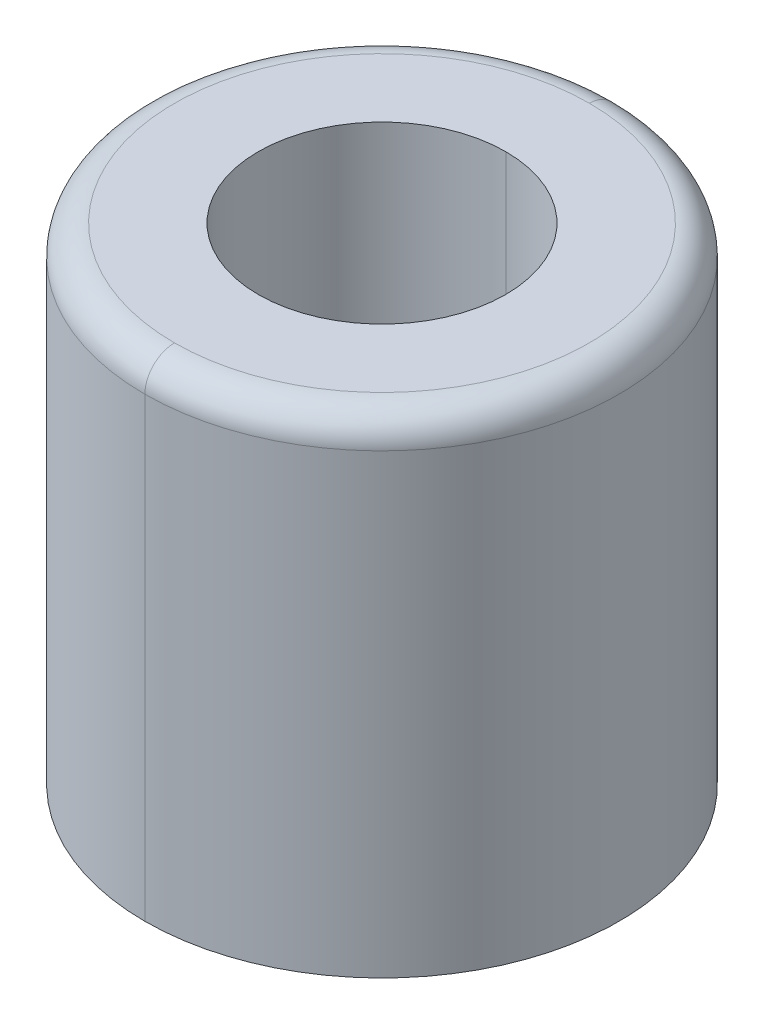
ISO-10303-21;
HEADER;
FILE_DESCRIPTION(('STEP AP214'),'2;1');
FILE_NAME('part.step','',(''),(''),'','','');
FILE_SCHEMA(('AUTOMOTIVE_DESIGN { 1 0 10303 214 1 1 1 1 }'));
ENDSEC;
DATA;
#1=APPLICATION_CONTEXT('core data for automotive mechanical design processes');
#2=APPLICATION_PROTOCOL_DEFINITION('international standard','automotive_design',2000,#1);
#3=PRODUCT_CONTEXT('',#1,'mechanical');
#4=PRODUCT('Part','Part','',(#3));
#5=PRODUCT_RELATED_PRODUCT_CATEGORY('part','',(#4));
#6=PRODUCT_DEFINITION_FORMATION('','',#4);
#7=PRODUCT_DEFINITION_CONTEXT('part definition',#1,'design');
#8=PRODUCT_DEFINITION('design','',#6,#7);
#9=PRODUCT_DEFINITION_SHAPE('','',#8);
#10=(LENGTH_UNIT() NAMED_UNIT(*) SI_UNIT(.MILLI.,.METRE.));
#11=(NAMED_UNIT(*) PLANE_ANGLE_UNIT() SI_UNIT($,.RADIAN.));
#12=(NAMED_UNIT(*) SI_UNIT($,.STERADIAN.) SOLID_ANGLE_UNIT());
#13=UNCERTAINTY_MEASURE_WITH_UNIT(LENGTH_MEASURE(1.E-05),#10,'distance_accuracy_value','');
#14=(GEOMETRIC_REPRESENTATION_CONTEXT(3) GLOBAL_UNCERTAINTY_ASSIGNED_CONTEXT((#13)) GLOBAL_UNIT_ASSIGNED_CONTEXT((#10,
#11,#12)) REPRESENTATION_CONTEXT('',''));
#15=CARTESIAN_POINT('',(0.,0.,0.));
#16=DIRECTION('',(0.,0.,1.));
#17=DIRECTION('',(1.,0.,0.));
#18=AXIS2_PLACEMENT_3D('',#15,#16,#17);
#19=CARTESIAN_POINT('',(0.,4.1656,0.));
#20=DIRECTION('',(0.,-1.,0.));
#21=DIRECTION('',(0.,0.,-1.));
#22=AXIS2_PLACEMENT_3D('',#19,#20,#21);
#23=CYLINDRICAL_SURFACE('',#22,4.064);
#24=DIRECTION('',(0.,-1.,0.));
#25=VECTOR('',#24,1.);
#26=CARTESIAN_POINT('',(0.,4.1656,4.064));
#27=LINE('',#26,#25);
#28=CARTESIAN_POINT('',(0.,3.6576,4.064));
#29=VERTEX_POINT('',#28);
#30=CARTESIAN_POINT('',(0.,-4.1656,4.064));
#31=VERTEX_POINT('',#30);
#32=EDGE_CURVE('E41',#29,#31,#27,.T.);
#33=ORIENTED_EDGE('',*,*,#32,.F.);
#34=CARTESIAN_POINT('',(0.,3.6576,0.));
#35=DIRECTION('',(0.,-1.,0.));
#36=DIRECTION('',(0.,0.,1.));
#37=AXIS2_PLACEMENT_3D('',#34,#35,#36);
#38=CIRCLE('',#37,4.064);
#39=CARTESIAN_POINT('',(0.,3.6576,-4.064));
#40=VERTEX_POINT('',#39);
#41=EDGE_CURVE('E10',#29,#40,#38,.T.);
#42=ORIENTED_EDGE('',*,*,#41,.T.);
#43=DIRECTION('',(0.,-1.,0.));
#44=VECTOR('',#43,1.);
#45=CARTESIAN_POINT('',(0.,4.1656,-4.064));
#46=LINE('',#45,#44);
#47=CARTESIAN_POINT('',(0.,-4.1656,-4.064));
#48=VERTEX_POINT('',#47);
#49=EDGE_CURVE('E30',#40,#48,#46,.T.);
#50=ORIENTED_EDGE('',*,*,#49,.T.);
#51=CARTESIAN_POINT('',(0.,-4.1656,0.));
#52=DIRECTION('',(0.,1.,0.));
#53=DIRECTION('',(0.,0.,1.));
#54=AXIS2_PLACEMENT_3D('',#51,#52,#53);
#55=CIRCLE('',#54,4.064);
#56=EDGE_CURVE('E108',#48,#31,#55,.T.);
#57=ORIENTED_EDGE('',*,*,#56,.T.);
#58=EDGE_LOOP('',(#33,#42,#50,#57));
#59=FACE_BOUND('',#58,.T.);
#60=ADVANCED_FACE('F16',(#59),#23,.T.);
#61=CARTESIAN_POINT('',(0.,-4.1656,0.));
#62=DIRECTION('',(0.,1.,0.));
#63=DIRECTION('',(1.,0.,0.));
#64=AXIS2_PLACEMENT_3D('',#61,#62,#63);
#65=PLANE('',#64);
#66=ORIENTED_EDGE('',*,*,#56,.F.);
#67=CARTESIAN_POINT('',(0.,-4.1656,0.));
#68=DIRECTION('',(0.,1.,0.));
#69=DIRECTION('',(0.,0.,1.));
#70=AXIS2_PLACEMENT_3D('',#67,#68,#69);
#71=CIRCLE('',#70,4.064);
#72=EDGE_CURVE('E97',#31,#48,#71,.T.);
#73=ORIENTED_EDGE('',*,*,#72,.F.);
#74=EDGE_LOOP('',(#66,#73));
#75=FACE_BOUND('',#74,.T.);
#76=CARTESIAN_POINT('',(0.,-4.1656,0.));
#77=DIRECTION('',(0.,1.,0.));
#78=DIRECTION('',(0.,0.,1.));
#79=AXIS2_PLACEMENT_3D('',#76,#77,#78);
#80=CIRCLE('',#79,2.1209);
#81=CARTESIAN_POINT('',(0.,-4.1656,-2.1209));
#82=VERTEX_POINT('',#81);
#83=CARTESIAN_POINT('',(0.,-4.1656,2.1209));
#84=VERTEX_POINT('',#83);
#85=EDGE_CURVE('E115',#82,#84,#80,.T.);
#86=ORIENTED_EDGE('',*,*,#85,.T.);
#87=CARTESIAN_POINT('',(0.,-4.1656,0.));
#88=DIRECTION('',(0.,1.,0.));
#89=DIRECTION('',(0.,0.,1.));
#90=AXIS2_PLACEMENT_3D('',#87,#88,#89);
#91=CIRCLE('',#90,2.1209);
#92=EDGE_CURVE('E93',#84,#82,#91,.T.);
#93=ORIENTED_EDGE('',*,*,#92,.T.);
#94=EDGE_LOOP('',(#86,#93));
#95=FACE_BOUND('',#94,.T.);
#96=ADVANCED_FACE('F171',(#75,#95),#65,.F.);
#97=CARTESIAN_POINT('',(0.,3.6576,0.));
#98=DIRECTION('',(0.,1.,0.));
#99=DIRECTION('',(0.,0.,1.));
#100=AXIS2_PLACEMENT_3D('',#97,#98,#99);
#101=TOROIDAL_SURFACE('',#100,3.556,0.508);
#102=CARTESIAN_POINT('',(0.,3.6576,-3.556));
#103=DIRECTION('',(1.,0.,0.));
#104=DIRECTION('',(0.,0.,-1.));
#105=AXIS2_PLACEMENT_3D('',#102,#103,#104);
#106=CIRCLE('',#105,0.508);
#107=CARTESIAN_POINT('',(0.,4.1656,-3.556));
#108=VERTEX_POINT('',#107);
#109=EDGE_CURVE('E92',#40,#108,#106,.T.);
#110=ORIENTED_EDGE('',*,*,#109,.F.);
#111=ORIENTED_EDGE('',*,*,#41,.F.);
#112=CARTESIAN_POINT('',(0.,3.6576,3.556));
#113=DIRECTION('',(-1.,0.,0.));
#114=DIRECTION('',(0.,0.,1.));
#115=AXIS2_PLACEMENT_3D('',#112,#113,#114);
#116=CIRCLE('',#115,0.508);
#117=CARTESIAN_POINT('',(0.,4.1656,3.556));
#118=VERTEX_POINT('',#117);
#119=EDGE_CURVE('E20',#29,#118,#116,.T.);
#120=ORIENTED_EDGE('',*,*,#119,.T.);
#121=CARTESIAN_POINT('',(0.,4.1656,0.));
#122=DIRECTION('',(0.,1.,0.));
#123=DIRECTION('',(0.,0.,1.));
#124=AXIS2_PLACEMENT_3D('',#121,#122,#123);
#125=CIRCLE('',#124,3.556);
#126=EDGE_CURVE('E113',#108,#118,#125,.T.);
#127=ORIENTED_EDGE('',*,*,#126,.F.);
#128=EDGE_LOOP('',(#110,#111,#120,#127));
#129=FACE_BOUND('',#128,.T.);
#130=ADVANCED_FACE('F149',(#129),#101,.T.);
#131=CARTESIAN_POINT('',(0.,4.1656,0.));
#132=DIRECTION('',(0.,-1.,0.));
#133=DIRECTION('',(0.,0.,-1.));
#134=AXIS2_PLACEMENT_3D('',#131,#132,#133);
#135=CYLINDRICAL_SURFACE('',#134,4.064);
#136=CARTESIAN_POINT('',(0.,3.6576,0.));
#137=DIRECTION('',(0.,-1.,0.));
#138=DIRECTION('',(0.,0.,1.));
#139=AXIS2_PLACEMENT_3D('',#136,#137,#138);
#140=CIRCLE('',#139,4.064);
#141=EDGE_CURVE('E118',#40,#29,#140,.T.);
#142=ORIENTED_EDGE('',*,*,#141,.T.);
#143=ORIENTED_EDGE('',*,*,#32,.T.);
#144=ORIENTED_EDGE('',*,*,#72,.T.);
#145=ORIENTED_EDGE('',*,*,#49,.F.);
#146=EDGE_LOOP('',(#142,#143,#144,#145));
#147=FACE_BOUND('',#146,.T.);
#148=ADVANCED_FACE('F165',(#147),#135,.T.);
#149=CARTESIAN_POINT('',(0.,4.1656,0.));
#150=DIRECTION('',(0.,-1.,0.));
#151=DIRECTION('',(0.,0.,-1.));
#152=AXIS2_PLACEMENT_3D('',#149,#150,#151);
#153=CYLINDRICAL_SURFACE('',#152,2.1209);
#154=DIRECTION('',(0.,-1.,0.));
#155=VECTOR('',#154,1.);
#156=CARTESIAN_POINT('',(0.,4.1656,2.1209));
#157=LINE('',#156,#155);
#158=CARTESIAN_POINT('',(0.,4.1656,2.1209));
#159=VERTEX_POINT('',#158);
#160=EDGE_CURVE('E88',#159,#84,#157,.T.);
#161=ORIENTED_EDGE('',*,*,#160,.F.);
#162=CARTESIAN_POINT('',(0.,4.1656,0.));
#163=DIRECTION('',(0.,1.,0.));
#164=DIRECTION('',(0.,0.,1.));
#165=AXIS2_PLACEMENT_3D('',#162,#163,#164);
#166=CIRCLE('',#165,2.1209);
#167=CARTESIAN_POINT('',(0.,4.1656,-2.1209));
#168=VERTEX_POINT('',#167);
#169=EDGE_CURVE('E90',#159,#168,#166,.T.);
#170=ORIENTED_EDGE('',*,*,#169,.T.);
#171=DIRECTION('',(0.,-1.,0.));
#172=VECTOR('',#171,1.);
#173=CARTESIAN_POINT('',(0.,4.1656,-2.1209));
#174=LINE('',#173,#172);
#175=EDGE_CURVE('E77',#168,#82,#174,.T.);
#176=ORIENTED_EDGE('',*,*,#175,.T.);
#177=ORIENTED_EDGE('',*,*,#92,.F.);
#178=EDGE_LOOP('',(#161,#170,#176,#177));
#179=FACE_BOUND('',#178,.T.);
#180=ADVANCED_FACE('F86',(#179),#153,.F.);
#181=CARTESIAN_POINT('',(0.,4.1656,0.));
#182=DIRECTION('',(0.,-1.,0.));
#183=DIRECTION('',(0.,0.,-1.));
#184=AXIS2_PLACEMENT_3D('',#181,#182,#183);
#185=CYLINDRICAL_SURFACE('',#184,2.1209);
#186=CARTESIAN_POINT('',(0.,4.1656,0.));
#187=DIRECTION('',(0.,1.,0.));
#188=DIRECTION('',(0.,0.,1.));
#189=AXIS2_PLACEMENT_3D('',#186,#187,#188);
#190=CIRCLE('',#189,2.1209);
#191=EDGE_CURVE('E94',#168,#159,#190,.T.);
#192=ORIENTED_EDGE('',*,*,#191,.T.);
#193=ORIENTED_EDGE('',*,*,#160,.T.);
#194=ORIENTED_EDGE('',*,*,#85,.F.);
#195=ORIENTED_EDGE('',*,*,#175,.F.);
#196=EDGE_LOOP('',(#192,#193,#194,#195));
#197=FACE_BOUND('',#196,.T.);
#198=ADVANCED_FACE('F101',(#197),#185,.F.);
#199=CARTESIAN_POINT('',(0.,3.6576,0.));
#200=DIRECTION('',(0.,1.,0.));
#201=DIRECTION('',(0.,0.,1.));
#202=AXIS2_PLACEMENT_3D('',#199,#200,#201);
#203=TOROIDAL_SURFACE('',#202,3.556,0.508);
#204=ORIENTED_EDGE('',*,*,#141,.F.);
#205=ORIENTED_EDGE('',*,*,#109,.T.);
#206=CARTESIAN_POINT('',(0.,4.1656,0.));
#207=DIRECTION('',(0.,1.,0.));
#208=DIRECTION('',(0.,0.,1.));
#209=AXIS2_PLACEMENT_3D('',#206,#207,#208);
#210=CIRCLE('',#209,3.556);
#211=EDGE_CURVE('E119',#118,#108,#210,.T.);
#212=ORIENTED_EDGE('',*,*,#211,.F.);
#213=ORIENTED_EDGE('',*,*,#119,.F.);
#214=EDGE_LOOP('',(#204,#205,#212,#213));
#215=FACE_BOUND('',#214,.T.);
#216=ADVANCED_FACE('F141',(#215),#203,.T.);
#217=CARTESIAN_POINT('',(0.,4.1656,0.));
#218=DIRECTION('',(0.,1.,0.));
#219=DIRECTION('',(1.,0.,0.));
#220=AXIS2_PLACEMENT_3D('',#217,#218,#219);
#221=PLANE('',#220);
#222=ORIENTED_EDGE('',*,*,#211,.T.);
#223=ORIENTED_EDGE('',*,*,#126,.T.);
#224=EDGE_LOOP('',(#222,#223));
#225=FACE_BOUND('',#224,.T.);
#226=ORIENTED_EDGE('',*,*,#191,.F.);
#227=ORIENTED_EDGE('',*,*,#169,.F.);
#228=EDGE_LOOP('',(#226,#227));
#229=FACE_BOUND('',#228,.T.);
#230=ADVANCED_FACE('F18',(#225,#229),#221,.T.);
#231=CLOSED_SHELL('',(#60,#96,#130,#148,#180,#198,#216,#230));
#232=MANIFOLD_SOLID_BREP('B1',#231);
#233=ADVANCED_BREP_SHAPE_REPRESENTATION('',(#18,#232),#14);
#234=SHAPE_DEFINITION_REPRESENTATION(#9,#233);
ENDSEC;
END-ISO-10303-21;
